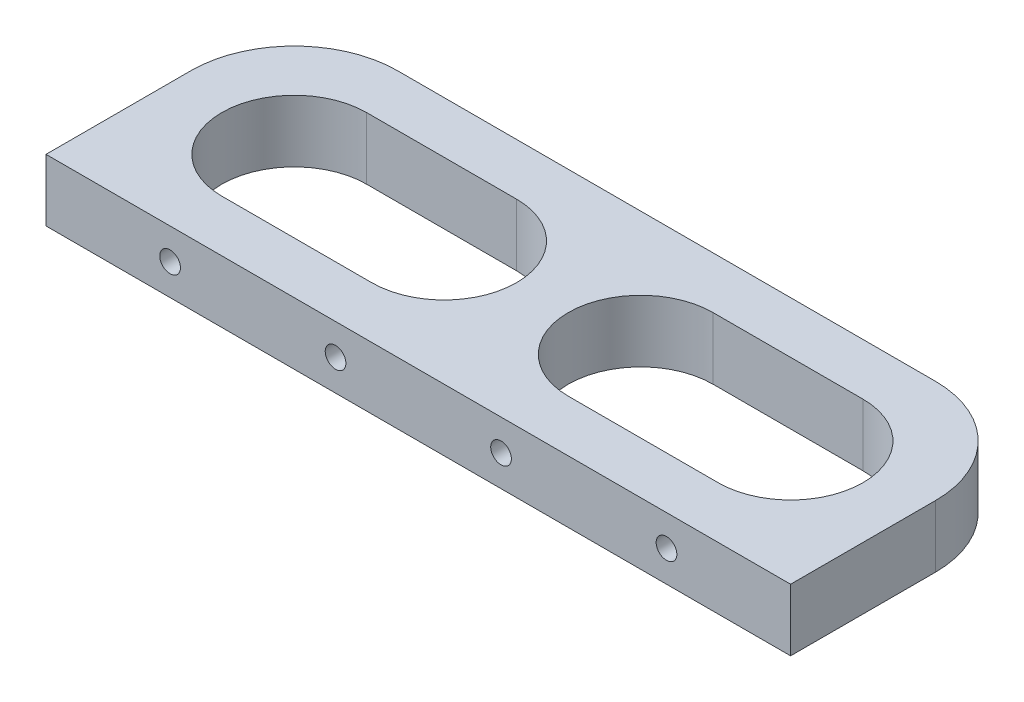
ISO-10303-21;
HEADER;
FILE_DESCRIPTION(('STEP AP214'),'2;1');
FILE_NAME('part.step','',(''),(''),'','','');
FILE_SCHEMA(('AUTOMOTIVE_DESIGN { 1 0 10303 214 1 1 1 1 }'));
ENDSEC;
DATA;
#1=APPLICATION_CONTEXT('core data for automotive mechanical design processes');
#2=APPLICATION_PROTOCOL_DEFINITION('international standard','automotive_design',2000,#1);
#3=PRODUCT_CONTEXT('',#1,'mechanical');
#4=PRODUCT('Part','Part','',(#3));
#5=PRODUCT_RELATED_PRODUCT_CATEGORY('part','',(#4));
#6=PRODUCT_DEFINITION_FORMATION('','',#4);
#7=PRODUCT_DEFINITION_CONTEXT('part definition',#1,'design');
#8=PRODUCT_DEFINITION('design','',#6,#7);
#9=PRODUCT_DEFINITION_SHAPE('','',#8);
#10=(LENGTH_UNIT() NAMED_UNIT(*) SI_UNIT(.MILLI.,.METRE.));
#11=(NAMED_UNIT(*) PLANE_ANGLE_UNIT() SI_UNIT($,.RADIAN.));
#12=(NAMED_UNIT(*) SI_UNIT($,.STERADIAN.) SOLID_ANGLE_UNIT());
#13=UNCERTAINTY_MEASURE_WITH_UNIT(LENGTH_MEASURE(1.E-05),#10,'distance_accuracy_value','');
#14=(GEOMETRIC_REPRESENTATION_CONTEXT(3) GLOBAL_UNCERTAINTY_ASSIGNED_CONTEXT((#13)) GLOBAL_UNIT_ASSIGNED_CONTEXT((#10,
#11,#12)) REPRESENTATION_CONTEXT('',''));
#15=CARTESIAN_POINT('',(0.,0.,0.));
#16=DIRECTION('',(0.,0.,1.));
#17=DIRECTION('',(1.,0.,0.));
#18=AXIS2_PLACEMENT_3D('',#15,#16,#17);
#19=CARTESIAN_POINT('',(90.,15.,-30.));
#20=DIRECTION('',(-1.,0.,0.));
#21=DIRECTION('',(0.,0.,1.));
#22=AXIS2_PLACEMENT_3D('',#19,#20,#21);
#23=PLANE('',#22);
#24=DIRECTION('',(0.,0.,-1.));
#25=VECTOR('',#24,1.);
#26=CARTESIAN_POINT('',(90.,0.,-30.));
#27=LINE('',#26,#25);
#28=CARTESIAN_POINT('',(90.,0.,30.));
#29=VERTEX_POINT('',#28);
#30=CARTESIAN_POINT('',(90.,0.,-5.));
#31=VERTEX_POINT('',#30);
#32=EDGE_CURVE('E355',#29,#31,#27,.T.);
#33=ORIENTED_EDGE('',*,*,#32,.T.);
#34=DIRECTION('',(0.,-1.,0.));
#35=VECTOR('',#34,1.);
#36=CARTESIAN_POINT('',(90.,15.,-5.));
#37=LINE('',#36,#35);
#38=CARTESIAN_POINT('',(90.,15.,-5.));
#39=VERTEX_POINT('',#38);
#40=EDGE_CURVE('E12',#31,#39,#37,.F.);
#41=ORIENTED_EDGE('',*,*,#40,.T.);
#42=DIRECTION('',(0.,0.,-1.));
#43=VECTOR('',#42,1.);
#44=CARTESIAN_POINT('',(90.,15.,-30.));
#45=LINE('',#44,#43);
#46=CARTESIAN_POINT('',(90.,15.,30.));
#47=VERTEX_POINT('',#46);
#48=EDGE_CURVE('E406',#47,#39,#45,.T.);
#49=ORIENTED_EDGE('',*,*,#48,.F.);
#50=DIRECTION('',(0.,-1.,0.));
#51=VECTOR('',#50,1.);
#52=CARTESIAN_POINT('',(90.,15.,30.));
#53=LINE('',#52,#51);
#54=EDGE_CURVE('E420',#47,#29,#53,.T.);
#55=ORIENTED_EDGE('',*,*,#54,.T.);
#56=EDGE_LOOP('',(#33,#41,#49,#55));
#57=FACE_BOUND('',#56,.T.);
#58=ADVANCED_FACE('F117',(#57),#23,.F.);
#59=CARTESIAN_POINT('',(-90.,15.,-30.));
#60=DIRECTION('',(0.,0.,1.));
#61=DIRECTION('',(1.,0.,0.));
#62=AXIS2_PLACEMENT_3D('',#59,#60,#61);
#63=PLANE('',#62);
#64=CARTESIAN_POINT('',(15.,7.49999999999998,-30.));
#65=DIRECTION('',(0.,0.,-1.));
#66=DIRECTION('',(-1.,0.,0.));
#67=AXIS2_PLACEMENT_3D('',#64,#65,#66);
#68=CIRCLE('',#67,2.49999999999999);
#69=CARTESIAN_POINT('',(12.5,7.49999999999998,-30.));
#70=VERTEX_POINT('',#69);
#71=EDGE_CURVE('E259',#70,#70,#68,.T.);
#72=ORIENTED_EDGE('',*,*,#71,.F.);
#73=EDGE_LOOP('',(#72));
#74=FACE_BOUND('',#73,.T.);
#75=CARTESIAN_POINT('',(-15.,7.49999999999998,-30.));
#76=DIRECTION('',(0.,0.,-1.));
#77=DIRECTION('',(-1.,0.,0.));
#78=AXIS2_PLACEMENT_3D('',#75,#76,#77);
#79=CIRCLE('',#78,2.49999999999999);
#80=CARTESIAN_POINT('',(-17.5,7.49999999999998,-30.));
#81=VERTEX_POINT('',#80);
#82=EDGE_CURVE('E253',#81,#81,#79,.T.);
#83=ORIENTED_EDGE('',*,*,#82,.F.);
#84=EDGE_LOOP('',(#83));
#85=FACE_BOUND('',#84,.T.);
#86=CARTESIAN_POINT('',(-45.,7.49999999999998,-30.));
#87=DIRECTION('',(0.,0.,-1.));
#88=DIRECTION('',(-1.,0.,0.));
#89=AXIS2_PLACEMENT_3D('',#86,#87,#88);
#90=CIRCLE('',#89,2.49999999999999);
#91=CARTESIAN_POINT('',(-47.5,7.49999999999998,-30.));
#92=VERTEX_POINT('',#91);
#93=EDGE_CURVE('E270',#92,#92,#90,.T.);
#94=ORIENTED_EDGE('',*,*,#93,.F.);
#95=EDGE_LOOP('',(#94));
#96=FACE_BOUND('',#95,.T.);
#97=CARTESIAN_POINT('',(45.,7.49999999999998,-30.));
#98=DIRECTION('',(0.,0.,-1.));
#99=DIRECTION('',(-1.,0.,0.));
#100=AXIS2_PLACEMENT_3D('',#97,#98,#99);
#101=CIRCLE('',#100,2.49999999999999);
#102=CARTESIAN_POINT('',(42.5,7.49999999999998,-30.));
#103=VERTEX_POINT('',#102);
#104=EDGE_CURVE('E280',#103,#103,#101,.T.);
#105=ORIENTED_EDGE('',*,*,#104,.F.);
#106=EDGE_LOOP('',(#105));
#107=FACE_BOUND('',#106,.T.);
#108=DIRECTION('',(-1.,0.,0.));
#109=VECTOR('',#108,1.);
#110=CARTESIAN_POINT('',(-90.,0.,-30.));
#111=LINE('',#110,#109);
#112=CARTESIAN_POINT('',(64.9999999999999,0.,-30.));
#113=VERTEX_POINT('',#112);
#114=CARTESIAN_POINT('',(-65.,0.,-30.));
#115=VERTEX_POINT('',#114);
#116=EDGE_CURVE('E421',#113,#115,#111,.T.);
#117=ORIENTED_EDGE('',*,*,#116,.T.);
#118=DIRECTION('',(0.,-1.,0.));
#119=VECTOR('',#118,1.);
#120=CARTESIAN_POINT('',(-65.,15.,-30.));
#121=LINE('',#120,#119);
#122=CARTESIAN_POINT('',(-65.,15.,-30.));
#123=VERTEX_POINT('',#122);
#124=EDGE_CURVE('E140',#115,#123,#121,.F.);
#125=ORIENTED_EDGE('',*,*,#124,.T.);
#126=DIRECTION('',(-1.,0.,0.));
#127=VECTOR('',#126,1.);
#128=CARTESIAN_POINT('',(-90.,15.,-30.));
#129=LINE('',#128,#127);
#130=CARTESIAN_POINT('',(64.9999999999999,15.,-30.));
#131=VERTEX_POINT('',#130);
#132=EDGE_CURVE('E407',#131,#123,#129,.T.);
#133=ORIENTED_EDGE('',*,*,#132,.F.);
#134=DIRECTION('',(0.,-1.,0.));
#135=VECTOR('',#134,1.);
#136=CARTESIAN_POINT('',(65.,15.,-30.));
#137=LINE('',#136,#135);
#138=EDGE_CURVE('E449',#131,#113,#137,.T.);
#139=ORIENTED_EDGE('',*,*,#138,.T.);
#140=EDGE_LOOP('',(#117,#125,#133,#139));
#141=FACE_BOUND('',#140,.T.);
#142=ADVANCED_FACE('F473',(#74,#85,#96,#107,#141),#63,.F.);
#143=CARTESIAN_POINT('',(-90.,15.,-30.));
#144=DIRECTION('',(1.,0.,0.));
#145=DIRECTION('',(0.,0.,-1.));
#146=AXIS2_PLACEMENT_3D('',#143,#144,#145);
#147=PLANE('',#146);
#148=DIRECTION('',(0.,0.,1.));
#149=VECTOR('',#148,1.);
#150=CARTESIAN_POINT('',(-90.,15.,-30.));
#151=LINE('',#150,#149);
#152=CARTESIAN_POINT('',(-90.,15.,-4.99999999999999));
#153=VERTEX_POINT('',#152);
#154=CARTESIAN_POINT('',(-90.,15.,30.));
#155=VERTEX_POINT('',#154);
#156=EDGE_CURVE('E413',#153,#155,#151,.T.);
#157=ORIENTED_EDGE('',*,*,#156,.F.);
#158=DIRECTION('',(0.,-1.,0.));
#159=VECTOR('',#158,1.);
#160=CARTESIAN_POINT('',(-90.,15.,-4.99999999999999));
#161=LINE('',#160,#159);
#162=CARTESIAN_POINT('',(-90.,0.,-4.99999999999999));
#163=VERTEX_POINT('',#162);
#164=EDGE_CURVE('E438',#153,#163,#161,.T.);
#165=ORIENTED_EDGE('',*,*,#164,.T.);
#166=DIRECTION('',(0.,0.,1.));
#167=VECTOR('',#166,1.);
#168=CARTESIAN_POINT('',(-90.,0.,-30.));
#169=LINE('',#168,#167);
#170=CARTESIAN_POINT('',(-90.,0.,30.));
#171=VERTEX_POINT('',#170);
#172=EDGE_CURVE('E428',#163,#171,#169,.T.);
#173=ORIENTED_EDGE('',*,*,#172,.T.);
#174=DIRECTION('',(0.,-1.,0.));
#175=VECTOR('',#174,1.);
#176=CARTESIAN_POINT('',(-90.,15.,30.));
#177=LINE('',#176,#175);
#178=EDGE_CURVE('E432',#155,#171,#177,.T.);
#179=ORIENTED_EDGE('',*,*,#178,.F.);
#180=EDGE_LOOP('',(#157,#165,#173,#179));
#181=FACE_BOUND('',#180,.T.);
#182=ADVANCED_FACE('F467',(#181),#147,.F.);
#183=CARTESIAN_POINT('',(-90.,15.,30.));
#184=DIRECTION('',(0.,0.,-1.));
#185=DIRECTION('',(-1.,0.,0.));
#186=AXIS2_PLACEMENT_3D('',#183,#184,#185);
#187=PLANE('',#186);
#188=CARTESIAN_POINT('',(-20.,7.5,30.));
#189=DIRECTION('',(0.,0.,1.));
#190=DIRECTION('',(1.,0.,0.));
#191=AXIS2_PLACEMENT_3D('',#188,#189,#190);
#192=CIRCLE('',#191,2.49999999999999);
#193=CARTESIAN_POINT('',(-17.5,7.5,30.));
#194=VERTEX_POINT('',#193);
#195=EDGE_CURVE('E286',#194,#194,#192,.T.);
#196=ORIENTED_EDGE('',*,*,#195,.F.);
#197=EDGE_LOOP('',(#196));
#198=FACE_BOUND('',#197,.T.);
#199=CARTESIAN_POINT('',(20.,7.5,30.));
#200=DIRECTION('',(0.,0.,1.));
#201=DIRECTION('',(1.,0.,0.));
#202=AXIS2_PLACEMENT_3D('',#199,#200,#201);
#203=CIRCLE('',#202,2.49999999999999);
#204=CARTESIAN_POINT('',(22.5,7.5,30.));
#205=VERTEX_POINT('',#204);
#206=EDGE_CURVE('E295',#205,#205,#203,.T.);
#207=ORIENTED_EDGE('',*,*,#206,.F.);
#208=EDGE_LOOP('',(#207));
#209=FACE_BOUND('',#208,.T.);
#210=CARTESIAN_POINT('',(-60.,7.5,30.));
#211=DIRECTION('',(0.,0.,1.));
#212=DIRECTION('',(1.,0.,0.));
#213=AXIS2_PLACEMENT_3D('',#210,#211,#212);
#214=CIRCLE('',#213,2.49999999999999);
#215=CARTESIAN_POINT('',(-57.5,7.5,30.));
#216=VERTEX_POINT('',#215);
#217=EDGE_CURVE('E305',#216,#216,#214,.T.);
#218=ORIENTED_EDGE('',*,*,#217,.F.);
#219=EDGE_LOOP('',(#218));
#220=FACE_BOUND('',#219,.T.);
#221=CARTESIAN_POINT('',(60.,7.5,30.));
#222=DIRECTION('',(0.,0.,1.));
#223=DIRECTION('',(1.,0.,0.));
#224=AXIS2_PLACEMENT_3D('',#221,#222,#223);
#225=CIRCLE('',#224,2.49999999999999);
#226=CARTESIAN_POINT('',(62.5,7.5,30.));
#227=VERTEX_POINT('',#226);
#228=EDGE_CURVE('E309',#227,#227,#225,.T.);
#229=ORIENTED_EDGE('',*,*,#228,.F.);
#230=EDGE_LOOP('',(#229));
#231=FACE_BOUND('',#230,.T.);
#232=DIRECTION('',(1.,0.,0.));
#233=VECTOR('',#232,1.);
#234=CARTESIAN_POINT('',(-90.,0.,30.));
#235=LINE('',#234,#233);
#236=EDGE_CURVE('E414',#171,#29,#235,.T.);
#237=ORIENTED_EDGE('',*,*,#236,.T.);
#238=ORIENTED_EDGE('',*,*,#54,.F.);
#239=DIRECTION('',(1.,0.,0.));
#240=VECTOR('',#239,1.);
#241=CARTESIAN_POINT('',(-90.,15.,30.));
#242=LINE('',#241,#240);
#243=EDGE_CURVE('E417',#155,#47,#242,.T.);
#244=ORIENTED_EDGE('',*,*,#243,.F.);
#245=ORIENTED_EDGE('',*,*,#178,.T.);
#246=EDGE_LOOP('',(#237,#238,#244,#245));
#247=FACE_BOUND('',#246,.T.);
#248=ADVANCED_FACE('F481',(#198,#209,#220,#231,#247),#187,.F.);
#249=CARTESIAN_POINT('',(0.,15.,0.));
#250=DIRECTION('',(0.,1.,0.));
#251=DIRECTION('',(0.,0.,1.));
#252=AXIS2_PLACEMENT_3D('',#249,#250,#251);
#253=PLANE('',#252);
#254=CARTESIAN_POINT('',(-60.,15.,0.));
#255=DIRECTION('',(0.,1.,0.));
#256=DIRECTION('',(0.,0.,1.));
#257=AXIS2_PLACEMENT_3D('',#254,#255,#256);
#258=CIRCLE('',#257,17.5);
#259=CARTESIAN_POINT('',(-60.,15.,-17.5));
#260=VERTEX_POINT('',#259);
#261=CARTESIAN_POINT('',(-60.,15.,17.5));
#262=VERTEX_POINT('',#261);
#263=EDGE_CURVE('E340',#260,#262,#258,.T.);
#264=ORIENTED_EDGE('',*,*,#263,.F.);
#265=DIRECTION('',(-1.,0.,0.));
#266=VECTOR('',#265,1.);
#267=CARTESIAN_POINT('',(-60.,15.,-17.5));
#268=LINE('',#267,#266);
#269=CARTESIAN_POINT('',(-23.75,15.,-17.5));
#270=VERTEX_POINT('',#269);
#271=EDGE_CURVE('E323',#270,#260,#268,.T.);
#272=ORIENTED_EDGE('',*,*,#271,.F.);
#273=CARTESIAN_POINT('',(-23.75,15.,0.));
#274=DIRECTION('',(0.,1.,0.));
#275=DIRECTION('',(0.,0.,1.));
#276=AXIS2_PLACEMENT_3D('',#273,#274,#275);
#277=CIRCLE('',#276,17.5);
#278=CARTESIAN_POINT('',(-23.75,15.,17.5));
#279=VERTEX_POINT('',#278);
#280=EDGE_CURVE('E342',#279,#270,#277,.T.);
#281=ORIENTED_EDGE('',*,*,#280,.F.);
#282=DIRECTION('',(1.,0.,0.));
#283=VECTOR('',#282,1.);
#284=CARTESIAN_POINT('',(-60.,15.,17.5));
#285=LINE('',#284,#283);
#286=EDGE_CURVE('E338',#262,#279,#285,.T.);
#287=ORIENTED_EDGE('',*,*,#286,.F.);
#288=EDGE_LOOP('',(#264,#272,#281,#287));
#289=FACE_BOUND('',#288,.T.);
#290=CARTESIAN_POINT('',(23.75,15.,0.));
#291=DIRECTION('',(0.,1.,0.));
#292=DIRECTION('',(0.,0.,1.));
#293=AXIS2_PLACEMENT_3D('',#290,#291,#292);
#294=CIRCLE('',#293,17.5);
#295=CARTESIAN_POINT('',(23.75,15.,-17.5));
#296=VERTEX_POINT('',#295);
#297=CARTESIAN_POINT('',(23.75,15.,17.5));
#298=VERTEX_POINT('',#297);
#299=EDGE_CURVE('E344',#296,#298,#294,.T.);
#300=ORIENTED_EDGE('',*,*,#299,.F.);
#301=DIRECTION('',(-1.,0.,0.));
#302=VECTOR('',#301,1.);
#303=CARTESIAN_POINT('',(23.75,15.,-17.5));
#304=LINE('',#303,#302);
#305=CARTESIAN_POINT('',(60.,15.,-17.5));
#306=VERTEX_POINT('',#305);
#307=EDGE_CURVE('E377',#306,#296,#304,.T.);
#308=ORIENTED_EDGE('',*,*,#307,.F.);
#309=CARTESIAN_POINT('',(60.,15.,0.));
#310=DIRECTION('',(0.,1.,0.));
#311=DIRECTION('',(0.,0.,1.));
#312=AXIS2_PLACEMENT_3D('',#309,#310,#311);
#313=CIRCLE('',#312,17.5);
#314=CARTESIAN_POINT('',(60.,15.,17.5));
#315=VERTEX_POINT('',#314);
#316=EDGE_CURVE('E385',#315,#306,#313,.T.);
#317=ORIENTED_EDGE('',*,*,#316,.F.);
#318=DIRECTION('',(1.,0.,0.));
#319=VECTOR('',#318,1.);
#320=CARTESIAN_POINT('',(23.75,15.,17.5));
#321=LINE('',#320,#319);
#322=EDGE_CURVE('E386',#298,#315,#321,.T.);
#323=ORIENTED_EDGE('',*,*,#322,.F.);
#324=EDGE_LOOP('',(#300,#308,#317,#323));
#325=FACE_BOUND('',#324,.T.);
#326=ORIENTED_EDGE('',*,*,#132,.T.);
#327=CARTESIAN_POINT('',(-65.,15.,-5.));
#328=DIRECTION('',(0.,1.,0.));
#329=DIRECTION('',(0.,0.,1.));
#330=AXIS2_PLACEMENT_3D('',#327,#328,#329);
#331=CIRCLE('',#330,25.);
#332=EDGE_CURVE('E126',#123,#153,#331,.T.);
#333=ORIENTED_EDGE('',*,*,#332,.T.);
#334=ORIENTED_EDGE('',*,*,#156,.T.);
#335=ORIENTED_EDGE('',*,*,#243,.T.);
#336=ORIENTED_EDGE('',*,*,#48,.T.);
#337=CARTESIAN_POINT('',(65.,15.,-5.));
#338=DIRECTION('',(0.,1.,0.));
#339=DIRECTION('',(0.,0.,1.));
#340=AXIS2_PLACEMENT_3D('',#337,#338,#339);
#341=CIRCLE('',#340,25.);
#342=EDGE_CURVE('E453',#39,#131,#341,.T.);
#343=ORIENTED_EDGE('',*,*,#342,.T.);
#344=EDGE_LOOP('',(#326,#333,#334,#335,#336,#343));
#345=FACE_BOUND('',#344,.T.);
#346=ADVANCED_FACE('F461',(#289,#325,#345),#253,.T.);
#347=CARTESIAN_POINT('',(0.,0.,0.));
#348=DIRECTION('',(0.,1.,0.));
#349=DIRECTION('',(0.,0.,1.));
#350=AXIS2_PLACEMENT_3D('',#347,#348,#349);
#351=PLANE('',#350);
#352=DIRECTION('',(-1.,0.,0.));
#353=VECTOR('',#352,1.);
#354=CARTESIAN_POINT('',(-60.,0.,-17.5));
#355=LINE('',#354,#353);
#356=CARTESIAN_POINT('',(-23.75,0.,-17.5));
#357=VERTEX_POINT('',#356);
#358=CARTESIAN_POINT('',(-60.,0.,-17.5));
#359=VERTEX_POINT('',#358);
#360=EDGE_CURVE('E332',#357,#359,#355,.T.);
#361=ORIENTED_EDGE('',*,*,#360,.T.);
#362=CARTESIAN_POINT('',(-60.,0.,0.));
#363=DIRECTION('',(0.,1.,0.));
#364=DIRECTION('',(0.,0.,1.));
#365=AXIS2_PLACEMENT_3D('',#362,#363,#364);
#366=CIRCLE('',#365,17.5);
#367=CARTESIAN_POINT('',(-60.,0.,17.5));
#368=VERTEX_POINT('',#367);
#369=EDGE_CURVE('E316',#359,#368,#366,.T.);
#370=ORIENTED_EDGE('',*,*,#369,.T.);
#371=DIRECTION('',(1.,0.,0.));
#372=VECTOR('',#371,1.);
#373=CARTESIAN_POINT('',(-60.,0.,17.5));
#374=LINE('',#373,#372);
#375=CARTESIAN_POINT('',(-23.75,0.,17.5));
#376=VERTEX_POINT('',#375);
#377=EDGE_CURVE('E325',#368,#376,#374,.T.);
#378=ORIENTED_EDGE('',*,*,#377,.T.);
#379=CARTESIAN_POINT('',(-23.75,0.,0.));
#380=DIRECTION('',(0.,1.,0.));
#381=DIRECTION('',(0.,0.,1.));
#382=AXIS2_PLACEMENT_3D('',#379,#380,#381);
#383=CIRCLE('',#382,17.5);
#384=EDGE_CURVE('E330',#376,#357,#383,.T.);
#385=ORIENTED_EDGE('',*,*,#384,.T.);
#386=EDGE_LOOP('',(#361,#370,#378,#385));
#387=FACE_BOUND('',#386,.T.);
#388=DIRECTION('',(-1.,0.,0.));
#389=VECTOR('',#388,1.);
#390=CARTESIAN_POINT('',(23.75,0.,-17.5));
#391=LINE('',#390,#389);
#392=CARTESIAN_POINT('',(60.,0.,-17.5));
#393=VERTEX_POINT('',#392);
#394=CARTESIAN_POINT('',(23.75,0.,-17.5));
#395=VERTEX_POINT('',#394);
#396=EDGE_CURVE('E367',#393,#395,#391,.T.);
#397=ORIENTED_EDGE('',*,*,#396,.T.);
#398=CARTESIAN_POINT('',(23.75,0.,0.));
#399=DIRECTION('',(0.,1.,0.));
#400=DIRECTION('',(0.,0.,1.));
#401=AXIS2_PLACEMENT_3D('',#398,#399,#400);
#402=CIRCLE('',#401,17.5);
#403=CARTESIAN_POINT('',(23.75,0.,17.5));
#404=VERTEX_POINT('',#403);
#405=EDGE_CURVE('E384',#395,#404,#402,.T.);
#406=ORIENTED_EDGE('',*,*,#405,.T.);
#407=DIRECTION('',(1.,0.,0.));
#408=VECTOR('',#407,1.);
#409=CARTESIAN_POINT('',(23.75,0.,17.5));
#410=LINE('',#409,#408);
#411=CARTESIAN_POINT('',(60.,0.,17.5));
#412=VERTEX_POINT('',#411);
#413=EDGE_CURVE('E400',#404,#412,#410,.T.);
#414=ORIENTED_EDGE('',*,*,#413,.T.);
#415=CARTESIAN_POINT('',(60.,0.,0.));
#416=DIRECTION('',(0.,1.,0.));
#417=DIRECTION('',(0.,0.,1.));
#418=AXIS2_PLACEMENT_3D('',#415,#416,#417);
#419=CIRCLE('',#418,17.5);
#420=EDGE_CURVE('E396',#412,#393,#419,.T.);
#421=ORIENTED_EDGE('',*,*,#420,.T.);
#422=EDGE_LOOP('',(#397,#406,#414,#421));
#423=FACE_BOUND('',#422,.T.);
#424=ORIENTED_EDGE('',*,*,#172,.F.);
#425=CARTESIAN_POINT('',(-65.,0.,-5.));
#426=DIRECTION('',(0.,1.,0.));
#427=DIRECTION('',(0.,0.,1.));
#428=AXIS2_PLACEMENT_3D('',#425,#426,#427);
#429=CIRCLE('',#428,25.);
#430=EDGE_CURVE('E444',#163,#115,#429,.F.);
#431=ORIENTED_EDGE('',*,*,#430,.T.);
#432=ORIENTED_EDGE('',*,*,#116,.F.);
#433=CARTESIAN_POINT('',(65.,0.,-5.));
#434=DIRECTION('',(0.,1.,0.));
#435=DIRECTION('',(0.,0.,1.));
#436=AXIS2_PLACEMENT_3D('',#433,#434,#435);
#437=CIRCLE('',#436,25.);
#438=EDGE_CURVE('E445',#113,#31,#437,.F.);
#439=ORIENTED_EDGE('',*,*,#438,.T.);
#440=ORIENTED_EDGE('',*,*,#32,.F.);
#441=ORIENTED_EDGE('',*,*,#236,.F.);
#442=EDGE_LOOP('',(#424,#431,#432,#439,#440,#441));
#443=FACE_BOUND('',#442,.T.);
#444=ADVANCED_FACE('F471',(#387,#423,#443),#351,.F.);
#445=CARTESIAN_POINT('',(23.75,0.,0.));
#446=DIRECTION('',(0.,1.,0.));
#447=DIRECTION('',(0.,0.,1.));
#448=AXIS2_PLACEMENT_3D('',#445,#446,#447);
#449=CYLINDRICAL_SURFACE('',#448,17.5);
#450=ORIENTED_EDGE('',*,*,#299,.T.);
#451=DIRECTION('',(0.,1.,0.));
#452=VECTOR('',#451,1.);
#453=CARTESIAN_POINT('',(23.75,0.,17.5));
#454=LINE('',#453,#452);
#455=EDGE_CURVE('E362',#404,#298,#454,.T.);
#456=ORIENTED_EDGE('',*,*,#455,.F.);
#457=ORIENTED_EDGE('',*,*,#405,.F.);
#458=DIRECTION('',(0.,1.,0.));
#459=VECTOR('',#458,1.);
#460=CARTESIAN_POINT('',(23.75,0.,-17.5));
#461=LINE('',#460,#459);
#462=EDGE_CURVE('E319',#395,#296,#461,.T.);
#463=ORIENTED_EDGE('',*,*,#462,.T.);
#464=EDGE_LOOP('',(#450,#456,#457,#463));
#465=FACE_BOUND('',#464,.T.);
#466=ADVANCED_FACE('F562',(#465),#449,.F.);
#467=CARTESIAN_POINT('',(23.75,0.,-17.5));
#468=DIRECTION('',(0.,0.,-1.));
#469=DIRECTION('',(-1.,0.,0.));
#470=AXIS2_PLACEMENT_3D('',#467,#468,#469);
#471=PLANE('',#470);
#472=ORIENTED_EDGE('',*,*,#307,.T.);
#473=ORIENTED_EDGE('',*,*,#462,.F.);
#474=ORIENTED_EDGE('',*,*,#396,.F.);
#475=DIRECTION('',(0.,1.,0.));
#476=VECTOR('',#475,1.);
#477=CARTESIAN_POINT('',(60.,0.,-17.5));
#478=LINE('',#477,#476);
#479=EDGE_CURVE('E373',#393,#306,#478,.T.);
#480=ORIENTED_EDGE('',*,*,#479,.T.);
#481=EDGE_LOOP('',(#472,#473,#474,#480));
#482=FACE_BOUND('',#481,.T.);
#483=ADVANCED_FACE('F570',(#482),#471,.F.);
#484=CARTESIAN_POINT('',(60.,0.,0.));
#485=DIRECTION('',(0.,1.,0.));
#486=DIRECTION('',(0.,0.,1.));
#487=AXIS2_PLACEMENT_3D('',#484,#485,#486);
#488=CYLINDRICAL_SURFACE('',#487,17.5);
#489=ORIENTED_EDGE('',*,*,#316,.T.);
#490=ORIENTED_EDGE('',*,*,#479,.F.);
#491=ORIENTED_EDGE('',*,*,#420,.F.);
#492=DIRECTION('',(0.,1.,0.));
#493=VECTOR('',#492,1.);
#494=CARTESIAN_POINT('',(60.,0.,17.5));
#495=LINE('',#494,#493);
#496=EDGE_CURVE('E369',#412,#315,#495,.T.);
#497=ORIENTED_EDGE('',*,*,#496,.T.);
#498=EDGE_LOOP('',(#489,#490,#491,#497));
#499=FACE_BOUND('',#498,.T.);
#500=ADVANCED_FACE('F571',(#499),#488,.F.);
#501=CARTESIAN_POINT('',(23.75,0.,17.5));
#502=DIRECTION('',(0.,0.,1.));
#503=DIRECTION('',(1.,0.,0.));
#504=AXIS2_PLACEMENT_3D('',#501,#502,#503);
#505=PLANE('',#504);
#506=ORIENTED_EDGE('',*,*,#322,.T.);
#507=ORIENTED_EDGE('',*,*,#496,.F.);
#508=ORIENTED_EDGE('',*,*,#413,.F.);
#509=ORIENTED_EDGE('',*,*,#455,.T.);
#510=EDGE_LOOP('',(#506,#507,#508,#509));
#511=FACE_BOUND('',#510,.T.);
#512=ADVANCED_FACE('F565',(#511),#505,.F.);
#513=CARTESIAN_POINT('',(-60.,0.,0.));
#514=DIRECTION('',(0.,1.,0.));
#515=DIRECTION('',(0.,0.,1.));
#516=AXIS2_PLACEMENT_3D('',#513,#514,#515);
#517=CYLINDRICAL_SURFACE('',#516,17.5);
#518=ORIENTED_EDGE('',*,*,#263,.T.);
#519=DIRECTION('',(0.,1.,0.));
#520=VECTOR('',#519,1.);
#521=CARTESIAN_POINT('',(-60.,0.,17.5));
#522=LINE('',#521,#520);
#523=EDGE_CURVE('E337',#368,#262,#522,.T.);
#524=ORIENTED_EDGE('',*,*,#523,.F.);
#525=ORIENTED_EDGE('',*,*,#369,.F.);
#526=DIRECTION('',(0.,1.,0.));
#527=VECTOR('',#526,1.);
#528=CARTESIAN_POINT('',(-60.,0.,-17.5));
#529=LINE('',#528,#527);
#530=EDGE_CURVE('E352',#359,#260,#529,.T.);
#531=ORIENTED_EDGE('',*,*,#530,.T.);
#532=EDGE_LOOP('',(#518,#524,#525,#531));
#533=FACE_BOUND('',#532,.T.);
#534=ADVANCED_FACE('F551',(#533),#517,.F.);
#535=CARTESIAN_POINT('',(-60.,0.,-17.5));
#536=DIRECTION('',(0.,0.,-1.));
#537=DIRECTION('',(-1.,0.,0.));
#538=AXIS2_PLACEMENT_3D('',#535,#536,#537);
#539=PLANE('',#538);
#540=ORIENTED_EDGE('',*,*,#271,.T.);
#541=ORIENTED_EDGE('',*,*,#530,.F.);
#542=ORIENTED_EDGE('',*,*,#360,.F.);
#543=DIRECTION('',(0.,1.,0.));
#544=VECTOR('',#543,1.);
#545=CARTESIAN_POINT('',(-23.75,0.,-17.5));
#546=LINE('',#545,#544);
#547=EDGE_CURVE('E358',#357,#270,#546,.T.);
#548=ORIENTED_EDGE('',*,*,#547,.T.);
#549=EDGE_LOOP('',(#540,#541,#542,#548));
#550=FACE_BOUND('',#549,.T.);
#551=ADVANCED_FACE('F548',(#550),#539,.F.);
#552=CARTESIAN_POINT('',(-23.75,0.,0.));
#553=DIRECTION('',(0.,1.,0.));
#554=DIRECTION('',(0.,0.,1.));
#555=AXIS2_PLACEMENT_3D('',#552,#553,#554);
#556=CYLINDRICAL_SURFACE('',#555,17.5);
#557=ORIENTED_EDGE('',*,*,#280,.T.);
#558=ORIENTED_EDGE('',*,*,#547,.F.);
#559=ORIENTED_EDGE('',*,*,#384,.F.);
#560=DIRECTION('',(0.,1.,0.));
#561=VECTOR('',#560,1.);
#562=CARTESIAN_POINT('',(-23.75,0.,17.5));
#563=LINE('',#562,#561);
#564=EDGE_CURVE('E360',#376,#279,#563,.T.);
#565=ORIENTED_EDGE('',*,*,#564,.T.);
#566=EDGE_LOOP('',(#557,#558,#559,#565));
#567=FACE_BOUND('',#566,.T.);
#568=ADVANCED_FACE('F552',(#567),#556,.F.);
#569=CARTESIAN_POINT('',(-60.,0.,17.5));
#570=DIRECTION('',(0.,0.,1.));
#571=DIRECTION('',(1.,0.,0.));
#572=AXIS2_PLACEMENT_3D('',#569,#570,#571);
#573=PLANE('',#572);
#574=ORIENTED_EDGE('',*,*,#286,.T.);
#575=ORIENTED_EDGE('',*,*,#564,.F.);
#576=ORIENTED_EDGE('',*,*,#377,.F.);
#577=ORIENTED_EDGE('',*,*,#523,.T.);
#578=EDGE_LOOP('',(#574,#575,#576,#577));
#579=FACE_BOUND('',#578,.T.);
#580=ADVANCED_FACE('F547',(#579),#573,.F.);
#581=CARTESIAN_POINT('',(60.,7.5,21.));
#582=DIRECTION('',(0.,0.,1.));
#583=DIRECTION('',(1.,0.,0.));
#584=AXIS2_PLACEMENT_3D('',#581,#582,#583);
#585=CONICAL_SURFACE('',#584,2.5,1.02974425867666);
#586=CARTESIAN_POINT('',(60.,7.5,19.4978484524311));
#587=VERTEX_POINT('',#586);
#588=VERTEX_LOOP('',#587);
#589=FACE_BOUND('',#588,.T.);
#590=CARTESIAN_POINT('',(60.,7.5,21.));
#591=DIRECTION('',(0.,0.,1.));
#592=DIRECTION('',(1.,0.,0.));
#593=AXIS2_PLACEMENT_3D('',#590,#591,#592);
#594=CIRCLE('',#593,2.5);
#595=CARTESIAN_POINT('',(62.5,7.5,21.));
#596=VERTEX_POINT('',#595);
#597=EDGE_CURVE('E313',#596,#596,#594,.T.);
#598=ORIENTED_EDGE('',*,*,#597,.T.);
#599=EDGE_LOOP('',(#598));
#600=FACE_BOUND('',#599,.T.);
#601=ADVANCED_FACE('F543',(#589,#600),#585,.F.);
#602=CARTESIAN_POINT('',(60.,7.5,30.));
#603=DIRECTION('',(0.,0.,1.));
#604=DIRECTION('',(1.,0.,0.));
#605=AXIS2_PLACEMENT_3D('',#602,#603,#604);
#606=CYLINDRICAL_SURFACE('',#605,2.5);
#607=ORIENTED_EDGE('',*,*,#597,.F.);
#608=EDGE_LOOP('',(#607));
#609=FACE_BOUND('',#608,.T.);
#610=ORIENTED_EDGE('',*,*,#228,.T.);
#611=EDGE_LOOP('',(#610));
#612=FACE_BOUND('',#611,.T.);
#613=ADVANCED_FACE('F537',(#609,#612),#606,.F.);
#614=CARTESIAN_POINT('',(-60.,7.5,21.));
#615=DIRECTION('',(0.,0.,1.));
#616=DIRECTION('',(1.,0.,0.));
#617=AXIS2_PLACEMENT_3D('',#614,#615,#616);
#618=CONICAL_SURFACE('',#617,2.5,1.02974425867665);
#619=CARTESIAN_POINT('',(-60.,7.5,19.4978484524311));
#620=VERTEX_POINT('',#619);
#621=VERTEX_LOOP('',#620);
#622=FACE_BOUND('',#621,.T.);
#623=CARTESIAN_POINT('',(-60.,7.5,21.));
#624=DIRECTION('',(0.,0.,1.));
#625=DIRECTION('',(1.,0.,0.));
#626=AXIS2_PLACEMENT_3D('',#623,#624,#625);
#627=CIRCLE('',#626,2.5);
#628=CARTESIAN_POINT('',(-57.5,7.5,21.));
#629=VERTEX_POINT('',#628);
#630=EDGE_CURVE('E306',#629,#629,#627,.T.);
#631=ORIENTED_EDGE('',*,*,#630,.T.);
#632=EDGE_LOOP('',(#631));
#633=FACE_BOUND('',#632,.T.);
#634=ADVANCED_FACE('F539',(#622,#633),#618,.F.);
#635=CARTESIAN_POINT('',(-60.,7.5,30.));
#636=DIRECTION('',(0.,0.,1.));
#637=DIRECTION('',(1.,0.,0.));
#638=AXIS2_PLACEMENT_3D('',#635,#636,#637);
#639=CYLINDRICAL_SURFACE('',#638,2.49999999999999);
#640=ORIENTED_EDGE('',*,*,#630,.F.);
#641=EDGE_LOOP('',(#640));
#642=FACE_BOUND('',#641,.T.);
#643=ORIENTED_EDGE('',*,*,#217,.T.);
#644=EDGE_LOOP('',(#643));
#645=FACE_BOUND('',#644,.T.);
#646=ADVANCED_FACE('F535',(#642,#645),#639,.F.);
#647=CARTESIAN_POINT('',(20.,7.5,21.));
#648=DIRECTION('',(0.,0.,1.));
#649=DIRECTION('',(1.,0.,0.));
#650=AXIS2_PLACEMENT_3D('',#647,#648,#649);
#651=CONICAL_SURFACE('',#650,2.5,1.02974425867665);
#652=CARTESIAN_POINT('',(20.,7.5,19.4978484524311));
#653=VERTEX_POINT('',#652);
#654=VERTEX_LOOP('',#653);
#655=FACE_BOUND('',#654,.T.);
#656=CARTESIAN_POINT('',(20.,7.5,21.));
#657=DIRECTION('',(0.,0.,1.));
#658=DIRECTION('',(1.,0.,0.));
#659=AXIS2_PLACEMENT_3D('',#656,#657,#658);
#660=CIRCLE('',#659,2.5);
#661=CARTESIAN_POINT('',(22.5,7.5,21.));
#662=VERTEX_POINT('',#661);
#663=EDGE_CURVE('E296',#662,#662,#660,.T.);
#664=ORIENTED_EDGE('',*,*,#663,.T.);
#665=EDGE_LOOP('',(#664));
#666=FACE_BOUND('',#665,.T.);
#667=ADVANCED_FACE('F529',(#655,#666),#651,.F.);
#668=CARTESIAN_POINT('',(20.,7.5,30.));
#669=DIRECTION('',(0.,0.,1.));
#670=DIRECTION('',(1.,0.,0.));
#671=AXIS2_PLACEMENT_3D('',#668,#669,#670);
#672=CYLINDRICAL_SURFACE('',#671,2.5);
#673=ORIENTED_EDGE('',*,*,#663,.F.);
#674=EDGE_LOOP('',(#673));
#675=FACE_BOUND('',#674,.T.);
#676=ORIENTED_EDGE('',*,*,#206,.T.);
#677=EDGE_LOOP('',(#676));
#678=FACE_BOUND('',#677,.T.);
#679=ADVANCED_FACE('F520',(#675,#678),#672,.F.);
#680=CARTESIAN_POINT('',(-20.,7.5,21.));
#681=DIRECTION('',(0.,0.,1.));
#682=DIRECTION('',(1.,0.,0.));
#683=AXIS2_PLACEMENT_3D('',#680,#681,#682);
#684=CONICAL_SURFACE('',#683,2.5,1.02974425867665);
#685=CARTESIAN_POINT('',(-20.,7.5,19.4978484524311));
#686=VERTEX_POINT('',#685);
#687=VERTEX_LOOP('',#686);
#688=FACE_BOUND('',#687,.T.);
#689=CARTESIAN_POINT('',(-20.,7.5,21.));
#690=DIRECTION('',(0.,0.,1.));
#691=DIRECTION('',(1.,0.,0.));
#692=AXIS2_PLACEMENT_3D('',#689,#690,#691);
#693=CIRCLE('',#692,2.5);
#694=CARTESIAN_POINT('',(-17.5,7.5,21.));
#695=VERTEX_POINT('',#694);
#696=EDGE_CURVE('E290',#695,#695,#693,.T.);
#697=ORIENTED_EDGE('',*,*,#696,.T.);
#698=EDGE_LOOP('',(#697));
#699=FACE_BOUND('',#698,.T.);
#700=ADVANCED_FACE('F515',(#688,#699),#684,.F.);
#701=CARTESIAN_POINT('',(-20.,7.5,30.));
#702=DIRECTION('',(0.,0.,1.));
#703=DIRECTION('',(1.,0.,0.));
#704=AXIS2_PLACEMENT_3D('',#701,#702,#703);
#705=CYLINDRICAL_SURFACE('',#704,2.5);
#706=ORIENTED_EDGE('',*,*,#696,.F.);
#707=EDGE_LOOP('',(#706));
#708=FACE_BOUND('',#707,.T.);
#709=ORIENTED_EDGE('',*,*,#195,.T.);
#710=EDGE_LOOP('',(#709));
#711=FACE_BOUND('',#710,.T.);
#712=ADVANCED_FACE('F506',(#708,#711),#705,.F.);
#713=CARTESIAN_POINT('',(-65.,15.,-5.));
#714=DIRECTION('',(0.,-1.,0.));
#715=DIRECTION('',(0.,0.,-1.));
#716=AXIS2_PLACEMENT_3D('',#713,#714,#715);
#717=CYLINDRICAL_SURFACE('',#716,25.);
#718=ORIENTED_EDGE('',*,*,#332,.F.);
#719=ORIENTED_EDGE('',*,*,#124,.F.);
#720=ORIENTED_EDGE('',*,*,#430,.F.);
#721=ORIENTED_EDGE('',*,*,#164,.F.);
#722=EDGE_LOOP('',(#718,#719,#720,#721));
#723=FACE_BOUND('',#722,.T.);
#724=ADVANCED_FACE('F469',(#723),#717,.T.);
#725=CARTESIAN_POINT('',(65.,15.,-5.));
#726=DIRECTION('',(0.,-1.,0.));
#727=DIRECTION('',(0.,0.,-1.));
#728=AXIS2_PLACEMENT_3D('',#725,#726,#727);
#729=CYLINDRICAL_SURFACE('',#728,25.);
#730=ORIENTED_EDGE('',*,*,#342,.F.);
#731=ORIENTED_EDGE('',*,*,#40,.F.);
#732=ORIENTED_EDGE('',*,*,#438,.F.);
#733=ORIENTED_EDGE('',*,*,#138,.F.);
#734=EDGE_LOOP('',(#730,#731,#732,#733));
#735=FACE_BOUND('',#734,.T.);
#736=ADVANCED_FACE('F119',(#735),#729,.T.);
#737=CARTESIAN_POINT('',(45.,7.49999999999998,-21.));
#738=DIRECTION('',(0.,0.,-1.));
#739=DIRECTION('',(-1.,0.,0.));
#740=AXIS2_PLACEMENT_3D('',#737,#738,#739);
#741=CONICAL_SURFACE('',#740,2.5,1.02974425867665);
#742=CARTESIAN_POINT('',(45.,7.49999999999998,-19.4978484524311));
#743=VERTEX_POINT('',#742);
#744=VERTEX_LOOP('',#743);
#745=FACE_BOUND('',#744,.T.);
#746=CARTESIAN_POINT('',(45.,7.49999999999998,-21.));
#747=DIRECTION('',(0.,0.,-1.));
#748=DIRECTION('',(-1.,0.,0.));
#749=AXIS2_PLACEMENT_3D('',#746,#747,#748);
#750=CIRCLE('',#749,2.5);
#751=CARTESIAN_POINT('',(42.5,7.49999999999998,-21.));
#752=VERTEX_POINT('',#751);
#753=EDGE_CURVE('E281',#752,#752,#750,.T.);
#754=ORIENTED_EDGE('',*,*,#753,.T.);
#755=EDGE_LOOP('',(#754));
#756=FACE_BOUND('',#755,.T.);
#757=ADVANCED_FACE('F512',(#745,#756),#741,.F.);
#758=CARTESIAN_POINT('',(45.,7.49999999999998,-30.));
#759=DIRECTION('',(0.,0.,-1.));
#760=DIRECTION('',(-1.,0.,0.));
#761=AXIS2_PLACEMENT_3D('',#758,#759,#760);
#762=CYLINDRICAL_SURFACE('',#761,2.49999999999999);
#763=ORIENTED_EDGE('',*,*,#753,.F.);
#764=EDGE_LOOP('',(#763));
#765=FACE_BOUND('',#764,.T.);
#766=ORIENTED_EDGE('',*,*,#104,.T.);
#767=EDGE_LOOP('',(#766));
#768=FACE_BOUND('',#767,.T.);
#769=ADVANCED_FACE('F719',(#765,#768),#762,.F.);
#770=CARTESIAN_POINT('',(-45.,7.49999999999998,-21.));
#771=DIRECTION('',(0.,0.,-1.));
#772=DIRECTION('',(-1.,0.,0.));
#773=AXIS2_PLACEMENT_3D('',#770,#771,#772);
#774=CONICAL_SURFACE('',#773,2.5,1.02974425867665);
#775=CARTESIAN_POINT('',(-45.,7.49999999999998,-19.4978484524311));
#776=VERTEX_POINT('',#775);
#777=VERTEX_LOOP('',#776);
#778=FACE_BOUND('',#777,.T.);
#779=CARTESIAN_POINT('',(-45.,7.49999999999998,-21.));
#780=DIRECTION('',(0.,0.,-1.));
#781=DIRECTION('',(-1.,0.,0.));
#782=AXIS2_PLACEMENT_3D('',#779,#780,#781);
#783=CIRCLE('',#782,2.5);
#784=CARTESIAN_POINT('',(-47.5,7.49999999999998,-21.));
#785=VERTEX_POINT('',#784);
#786=EDGE_CURVE('E274',#785,#785,#783,.T.);
#787=ORIENTED_EDGE('',*,*,#786,.T.);
#788=EDGE_LOOP('',(#787));
#789=FACE_BOUND('',#788,.T.);
#790=ADVANCED_FACE('F723',(#778,#789),#774,.F.);
#791=CARTESIAN_POINT('',(-45.,7.49999999999998,-30.));
#792=DIRECTION('',(0.,0.,-1.));
#793=DIRECTION('',(-1.,0.,0.));
#794=AXIS2_PLACEMENT_3D('',#791,#792,#793);
#795=CYLINDRICAL_SURFACE('',#794,2.49999999999999);
#796=ORIENTED_EDGE('',*,*,#786,.F.);
#797=EDGE_LOOP('',(#796));
#798=FACE_BOUND('',#797,.T.);
#799=ORIENTED_EDGE('',*,*,#93,.T.);
#800=EDGE_LOOP('',(#799));
#801=FACE_BOUND('',#800,.T.);
#802=ADVANCED_FACE('F731',(#798,#801),#795,.F.);
#803=CARTESIAN_POINT('',(-15.,7.49999999999998,-21.));
#804=DIRECTION('',(0.,0.,-1.));
#805=DIRECTION('',(-1.,0.,0.));
#806=AXIS2_PLACEMENT_3D('',#803,#804,#805);
#807=CONICAL_SURFACE('',#806,2.5,1.02974425867665);
#808=CARTESIAN_POINT('',(-15.,7.49999999999998,-19.4978484524311));
#809=VERTEX_POINT('',#808);
#810=VERTEX_LOOP('',#809);
#811=FACE_BOUND('',#810,.T.);
#812=CARTESIAN_POINT('',(-15.,7.49999999999998,-21.));
#813=DIRECTION('',(0.,0.,-1.));
#814=DIRECTION('',(-1.,0.,0.));
#815=AXIS2_PLACEMENT_3D('',#812,#813,#814);
#816=CIRCLE('',#815,2.5);
#817=CARTESIAN_POINT('',(-17.5,7.49999999999998,-21.));
#818=VERTEX_POINT('',#817);
#819=EDGE_CURVE('E261',#818,#818,#816,.T.);
#820=ORIENTED_EDGE('',*,*,#819,.T.);
#821=EDGE_LOOP('',(#820));
#822=FACE_BOUND('',#821,.T.);
#823=ADVANCED_FACE('F741',(#811,#822),#807,.F.);
#824=CARTESIAN_POINT('',(-15.,7.49999999999998,-30.));
#825=DIRECTION('',(0.,0.,-1.));
#826=DIRECTION('',(-1.,0.,0.));
#827=AXIS2_PLACEMENT_3D('',#824,#825,#826);
#828=CYLINDRICAL_SURFACE('',#827,2.49999999999999);
#829=ORIENTED_EDGE('',*,*,#819,.F.);
#830=EDGE_LOOP('',(#829));
#831=FACE_BOUND('',#830,.T.);
#832=ORIENTED_EDGE('',*,*,#82,.T.);
#833=EDGE_LOOP('',(#832));
#834=FACE_BOUND('',#833,.T.);
#835=ADVANCED_FACE('F247',(#831,#834),#828,.F.);
#836=CARTESIAN_POINT('',(15.,7.49999999999998,-21.));
#837=DIRECTION('',(0.,0.,-1.));
#838=DIRECTION('',(-1.,0.,0.));
#839=AXIS2_PLACEMENT_3D('',#836,#837,#838);
#840=CONICAL_SURFACE('',#839,2.5,1.02974425867665);
#841=CARTESIAN_POINT('',(15.,7.49999999999998,-19.4978484524311));
#842=VERTEX_POINT('',#841);
#843=VERTEX_LOOP('',#842);
#844=FACE_BOUND('',#843,.T.);
#845=CARTESIAN_POINT('',(15.,7.49999999999998,-21.));
#846=DIRECTION('',(0.,0.,-1.));
#847=DIRECTION('',(-1.,0.,0.));
#848=AXIS2_PLACEMENT_3D('',#845,#846,#847);
#849=CIRCLE('',#848,2.5);
#850=CARTESIAN_POINT('',(12.5,7.49999999999998,-21.));
#851=VERTEX_POINT('',#850);
#852=EDGE_CURVE('E255',#851,#851,#849,.T.);
#853=ORIENTED_EDGE('',*,*,#852,.T.);
#854=EDGE_LOOP('',(#853));
#855=FACE_BOUND('',#854,.T.);
#856=ADVANCED_FACE('F242',(#844,#855),#840,.F.);
#857=CARTESIAN_POINT('',(15.,7.49999999999998,-30.));
#858=DIRECTION('',(0.,0.,-1.));
#859=DIRECTION('',(-1.,0.,0.));
#860=AXIS2_PLACEMENT_3D('',#857,#858,#859);
#861=CYLINDRICAL_SURFACE('',#860,2.49999999999999);
#862=ORIENTED_EDGE('',*,*,#852,.F.);
#863=EDGE_LOOP('',(#862));
#864=FACE_BOUND('',#863,.T.);
#865=ORIENTED_EDGE('',*,*,#71,.T.);
#866=EDGE_LOOP('',(#865));
#867=FACE_BOUND('',#866,.T.);
#868=ADVANCED_FACE('F250',(#864,#867),#861,.F.);
#869=CLOSED_SHELL('',(#58,#142,#182,#248,#346,#444,#466,#483,#500,#512,#534,#551,#568,#580,#601,
#613,#634,#646,#667,#679,#700,#712,#724,#736,#757,#769,#790,#802,#823,#835,#856,#868));
#870=MANIFOLD_SOLID_BREP('B2',#869);
#871=ADVANCED_BREP_SHAPE_REPRESENTATION('',(#18,#870),#14);
#872=SHAPE_DEFINITION_REPRESENTATION(#9,#871);
ENDSEC;
END-ISO-10303-21;
